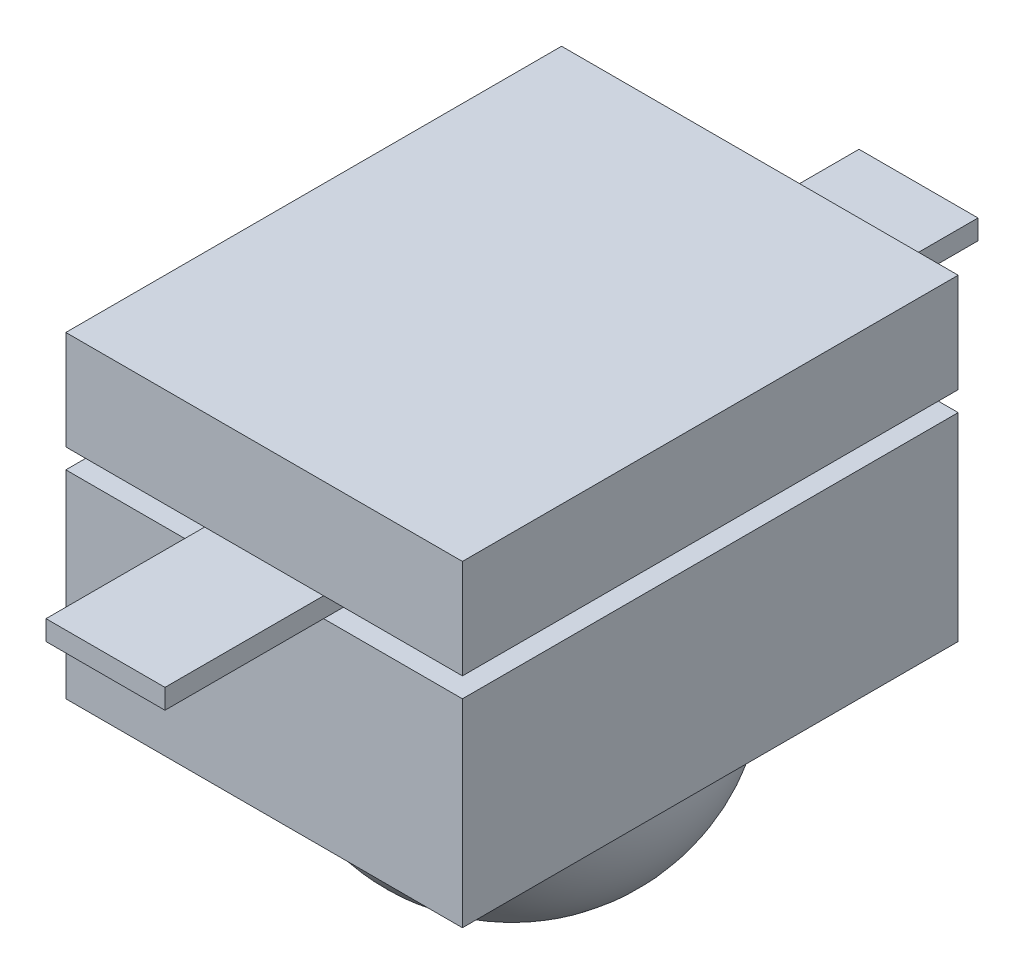
ISO-10303-21;
HEADER;
FILE_DESCRIPTION(('STEP AP214'),'2;1');
FILE_NAME('part.step','',(''),(''),'','','');
FILE_SCHEMA(('AUTOMOTIVE_DESIGN { 1 0 10303 214 1 1 1 1 }'));
ENDSEC;
DATA;
#1=APPLICATION_CONTEXT('core data for automotive mechanical design processes');
#2=APPLICATION_PROTOCOL_DEFINITION('international standard','automotive_design',2000,#1);
#3=PRODUCT_CONTEXT('',#1,'mechanical');
#4=PRODUCT('Part','Part','',(#3));
#5=PRODUCT_RELATED_PRODUCT_CATEGORY('part','',(#4));
#6=PRODUCT_DEFINITION_FORMATION('','',#4);
#7=PRODUCT_DEFINITION_CONTEXT('part definition',#1,'design');
#8=PRODUCT_DEFINITION('design','',#6,#7);
#9=PRODUCT_DEFINITION_SHAPE('','',#8);
#10=(LENGTH_UNIT() NAMED_UNIT(*) SI_UNIT(.MILLI.,.METRE.));
#11=(NAMED_UNIT(*) PLANE_ANGLE_UNIT() SI_UNIT($,.RADIAN.));
#12=(NAMED_UNIT(*) SI_UNIT($,.STERADIAN.) SOLID_ANGLE_UNIT());
#13=UNCERTAINTY_MEASURE_WITH_UNIT(LENGTH_MEASURE(1.E-05),#10,'distance_accuracy_value','');
#14=(GEOMETRIC_REPRESENTATION_CONTEXT(3) GLOBAL_UNCERTAINTY_ASSIGNED_CONTEXT((#13)) GLOBAL_UNIT_ASSIGNED_CONTEXT((#10,
#11,#12)) REPRESENTATION_CONTEXT('',''));
#15=CARTESIAN_POINT('',(0.,0.,0.));
#16=DIRECTION('',(0.,0.,1.));
#17=DIRECTION('',(1.,0.,0.));
#18=AXIS2_PLACEMENT_3D('',#15,#16,#17);
#19=CARTESIAN_POINT('',(0.,1.1,0.));
#20=DIRECTION('',(0.,-1.,0.));
#21=DIRECTION('',(0.,0.,-1.));
#22=AXIS2_PLACEMENT_3D('',#19,#20,#21);
#23=PLANE('',#22);
#24=DIRECTION('',(1.,0.,0.));
#25=VECTOR('',#24,1.);
#26=CARTESIAN_POINT('',(-8.56044129833983,1.1,9.74809966000599));
#27=LINE('',#26,#25);
#28=CARTESIAN_POINT('',(-9.86044129833983,1.1,9.74809966000599));
#29=VERTEX_POINT('',#28);
#30=CARTESIAN_POINT('',(-9.26044129833983,1.1,9.74809966000599));
#31=VERTEX_POINT('',#30);
#32=EDGE_CURVE('E124',#29,#31,#27,.T.);
#33=ORIENTED_EDGE('',*,*,#32,.F.);
#34=DIRECTION('',(0.,0.,1.));
#35=VECTOR('',#34,1.);
#36=CARTESIAN_POINT('',(-9.86044129833983,1.1,9.54809966000599));
#37=LINE('',#36,#35);
#38=CARTESIAN_POINT('',(-9.86044129833983,1.1,10.548099660006));
#39=VERTEX_POINT('',#38);
#40=EDGE_CURVE('E389',#29,#39,#37,.T.);
#41=ORIENTED_EDGE('',*,*,#40,.T.);
#42=DIRECTION('',(1.,0.,0.));
#43=VECTOR('',#42,1.);
#44=CARTESIAN_POINT('',(-9.86044129833983,1.1,10.548099660006));
#45=LINE('',#44,#43);
#46=CARTESIAN_POINT('',(-9.26044129833983,1.1,10.548099660006));
#47=VERTEX_POINT('',#46);
#48=EDGE_CURVE('E559',#39,#47,#45,.T.);
#49=ORIENTED_EDGE('',*,*,#48,.T.);
#50=DIRECTION('',(0.,0.,1.));
#51=VECTOR('',#50,1.);
#52=CARTESIAN_POINT('',(-9.26044129833983,1.1,9.54809966000599));
#53=LINE('',#52,#51);
#54=EDGE_CURVE('E108',#31,#47,#53,.T.);
#55=ORIENTED_EDGE('',*,*,#54,.F.);
#56=EDGE_LOOP('',(#33,#41,#49,#55));
#57=FACE_BOUND('',#56,.T.);
#58=ADVANCED_FACE('F104',(#57),#23,.F.);
#59=CARTESIAN_POINT('',(0.,1.,0.));
#60=DIRECTION('',(0.,1.,0.));
#61=DIRECTION('',(0.,0.,1.));
#62=AXIS2_PLACEMENT_3D('',#59,#60,#61);
#63=PLANE('',#62);
#64=DIRECTION('',(0.,0.,-1.));
#65=VECTOR('',#64,1.);
#66=CARTESIAN_POINT('',(-9.86044129833983,1.,7.44809966000599));
#67=LINE('',#66,#65);
#68=CARTESIAN_POINT('',(-9.86044129833983,1.,7.44809966000599));
#69=VERTEX_POINT('',#68);
#70=CARTESIAN_POINT('',(-9.86044129833983,1.,7.24809966000599));
#71=VERTEX_POINT('',#70);
#72=EDGE_CURVE('E366',#69,#71,#67,.T.);
#73=ORIENTED_EDGE('',*,*,#72,.T.);
#74=DIRECTION('',(-1.,0.,0.));
#75=VECTOR('',#74,1.);
#76=CARTESIAN_POINT('',(-10.5604412983398,1.,7.24809966000599));
#77=LINE('',#76,#75);
#78=CARTESIAN_POINT('',(-10.5604412983398,1.,7.24809966000599));
#79=VERTEX_POINT('',#78);
#80=EDGE_CURVE('E487',#71,#79,#77,.T.);
#81=ORIENTED_EDGE('',*,*,#80,.T.);
#82=DIRECTION('',(0.,0.,1.));
#83=VECTOR('',#82,1.);
#84=CARTESIAN_POINT('',(-10.5604412983398,1.,7.24809966000599));
#85=LINE('',#84,#83);
#86=CARTESIAN_POINT('',(-10.5604412983398,1.,9.74809966000599));
#87=VERTEX_POINT('',#86);
#88=EDGE_CURVE('E530',#79,#87,#85,.T.);
#89=ORIENTED_EDGE('',*,*,#88,.T.);
#90=DIRECTION('',(1.,0.,0.));
#91=VECTOR('',#90,1.);
#92=CARTESIAN_POINT('',(-10.5604412983398,1.,9.74809966000599));
#93=LINE('',#92,#91);
#94=CARTESIAN_POINT('',(-9.86044129833983,1.,9.74809966000599));
#95=VERTEX_POINT('',#94);
#96=EDGE_CURVE('E524',#87,#95,#93,.T.);
#97=ORIENTED_EDGE('',*,*,#96,.T.);
#98=DIRECTION('',(0.,0.,1.));
#99=VECTOR('',#98,1.);
#100=CARTESIAN_POINT('',(-9.86044129833983,1.,9.54809966000599));
#101=LINE('',#100,#99);
#102=CARTESIAN_POINT('',(-9.86044129833983,1.,9.54809966000599));
#103=VERTEX_POINT('',#102);
#104=EDGE_CURVE('E536',#103,#95,#101,.T.);
#105=ORIENTED_EDGE('',*,*,#104,.F.);
#106=DIRECTION('',(-1.,0.,0.));
#107=VECTOR('',#106,1.);
#108=CARTESIAN_POINT('',(-8.76044129833983,1.,9.54809966000599));
#109=LINE('',#108,#107);
#110=CARTESIAN_POINT('',(-10.3604412983398,1.,9.54809966000599));
#111=VERTEX_POINT('',#110);
#112=EDGE_CURVE('E950',#103,#111,#109,.T.);
#113=ORIENTED_EDGE('',*,*,#112,.T.);
#114=DIRECTION('',(0.,0.,-1.));
#115=VECTOR('',#114,1.);
#116=CARTESIAN_POINT('',(-10.3604412983398,1.,9.54809966000599));
#117=LINE('',#116,#115);
#118=CARTESIAN_POINT('',(-10.3604412983398,1.,8.94809966000599));
#119=VERTEX_POINT('',#118);
#120=EDGE_CURVE('E579',#111,#119,#117,.T.);
#121=ORIENTED_EDGE('',*,*,#120,.T.);
#122=DIRECTION('',(1.,0.,0.));
#123=VECTOR('',#122,1.);
#124=CARTESIAN_POINT('',(-10.3604412983398,1.,8.94809966000599));
#125=LINE('',#124,#123);
#126=CARTESIAN_POINT('',(-9.11044129833983,1.,8.94809966000599));
#127=VERTEX_POINT('',#126);
#128=EDGE_CURVE('E586',#119,#127,#125,.T.);
#129=ORIENTED_EDGE('',*,*,#128,.T.);
#130=DIRECTION('',(0.,0.,-1.));
#131=VECTOR('',#130,1.);
#132=CARTESIAN_POINT('',(-9.11044129833983,1.,8.94809966000599));
#133=LINE('',#132,#131);
#134=CARTESIAN_POINT('',(-9.11044129833983,1.,8.21997020015758));
#135=VERTEX_POINT('',#134);
#136=EDGE_CURVE('E996',#127,#135,#133,.T.);
#137=ORIENTED_EDGE('',*,*,#136,.T.);
#138=DIRECTION('',(1.,0.,0.));
#139=VECTOR('',#138,1.);
#140=CARTESIAN_POINT('',(-9.11044129833983,1.,8.21997020015758));
#141=LINE('',#140,#139);
#142=CARTESIAN_POINT('',(-8.76044129833983,1.,8.21997020015758));
#143=VERTEX_POINT('',#142);
#144=EDGE_CURVE('E959',#135,#143,#141,.T.);
#145=ORIENTED_EDGE('',*,*,#144,.T.);
#146=DIRECTION('',(0.,0.,1.));
#147=VECTOR('',#146,1.);
#148=CARTESIAN_POINT('',(-8.76044129833983,1.,8.21997020015758));
#149=LINE('',#148,#147);
#150=CARTESIAN_POINT('',(-8.76044129833983,1.,9.54809966000599));
#151=VERTEX_POINT('',#150);
#152=EDGE_CURVE('E955',#143,#151,#149,.T.);
#153=ORIENTED_EDGE('',*,*,#152,.T.);
#154=CARTESIAN_POINT('',(-9.26044129833983,1.,9.54809966000599));
#155=VERTEX_POINT('',#154);
#156=EDGE_CURVE('E954',#151,#155,#109,.T.);
#157=ORIENTED_EDGE('',*,*,#156,.T.);
#158=DIRECTION('',(0.,0.,1.));
#159=VECTOR('',#158,1.);
#160=CARTESIAN_POINT('',(-9.26044129833983,1.,9.54809966000599));
#161=LINE('',#160,#159);
#162=CARTESIAN_POINT('',(-9.26044129833983,1.,9.74809966000599));
#163=VERTEX_POINT('',#162);
#164=EDGE_CURVE('E551',#155,#163,#161,.T.);
#165=ORIENTED_EDGE('',*,*,#164,.T.);
#166=CARTESIAN_POINT('',(-8.56044129833983,1.,9.74809966000599));
#167=VERTEX_POINT('',#166);
#168=EDGE_CURVE('E528',#163,#167,#93,.T.);
#169=ORIENTED_EDGE('',*,*,#168,.T.);
#170=DIRECTION('',(0.,0.,-1.));
#171=VECTOR('',#170,1.);
#172=CARTESIAN_POINT('',(-8.56044129833983,1.,7.24809966000599));
#173=LINE('',#172,#171);
#174=CARTESIAN_POINT('',(-8.56044129833983,1.,7.24809966000599));
#175=VERTEX_POINT('',#174);
#176=EDGE_CURVE('E515',#167,#175,#173,.T.);
#177=ORIENTED_EDGE('',*,*,#176,.T.);
#178=CARTESIAN_POINT('',(-9.26044129833983,1.,7.24809966000599));
#179=VERTEX_POINT('',#178);
#180=EDGE_CURVE('E500',#175,#179,#77,.T.);
#181=ORIENTED_EDGE('',*,*,#180,.T.);
#182=DIRECTION('',(0.,0.,-1.));
#183=VECTOR('',#182,1.);
#184=CARTESIAN_POINT('',(-9.26044129833983,1.,7.44809966000599));
#185=LINE('',#184,#183);
#186=CARTESIAN_POINT('',(-9.26044129833983,1.,7.44809966000599));
#187=VERTEX_POINT('',#186);
#188=EDGE_CURVE('E354',#187,#179,#185,.T.);
#189=ORIENTED_EDGE('',*,*,#188,.F.);
#190=DIRECTION('',(-1.,0.,0.));
#191=VECTOR('',#190,1.);
#192=CARTESIAN_POINT('',(-8.76044129833983,1.,7.44809966000599));
#193=LINE('',#192,#191);
#194=CARTESIAN_POINT('',(-8.76044129833983,1.,7.44809966000599));
#195=VERTEX_POINT('',#194);
#196=EDGE_CURVE('E439',#195,#187,#193,.T.);
#197=ORIENTED_EDGE('',*,*,#196,.F.);
#198=DIRECTION('',(0.,0.,-1.));
#199=VECTOR('',#198,1.);
#200=CARTESIAN_POINT('',(-8.76044129833983,1.,8.11997020015759));
#201=LINE('',#200,#199);
#202=CARTESIAN_POINT('',(-8.76044129833983,1.,8.11997020015759));
#203=VERTEX_POINT('',#202);
#204=EDGE_CURVE('E428',#203,#195,#201,.T.);
#205=ORIENTED_EDGE('',*,*,#204,.F.);
#206=DIRECTION('',(1.,0.,0.));
#207=VECTOR('',#206,1.);
#208=CARTESIAN_POINT('',(-9.21044129833983,1.,8.11997020015759));
#209=LINE('',#208,#207);
#210=CARTESIAN_POINT('',(-9.21044129833983,1.,8.11997020015759));
#211=VERTEX_POINT('',#210);
#212=EDGE_CURVE('E459',#211,#203,#209,.T.);
#213=ORIENTED_EDGE('',*,*,#212,.F.);
#214=DIRECTION('',(0.,0.,-1.));
#215=VECTOR('',#214,1.);
#216=CARTESIAN_POINT('',(-9.21044129833983,1.,8.84809966000599));
#217=LINE('',#216,#215);
#218=CARTESIAN_POINT('',(-9.21044129833983,1.,8.84809966000599));
#219=VERTEX_POINT('',#218);
#220=EDGE_CURVE('E462',#219,#211,#217,.T.);
#221=ORIENTED_EDGE('',*,*,#220,.F.);
#222=DIRECTION('',(1.,0.,0.));
#223=VECTOR('',#222,1.);
#224=CARTESIAN_POINT('',(-10.3604412983398,1.,8.84809966000599));
#225=LINE('',#224,#223);
#226=CARTESIAN_POINT('',(-10.3604412983398,1.,8.84809966000599));
#227=VERTEX_POINT('',#226);
#228=EDGE_CURVE('E464',#227,#219,#225,.T.);
#229=ORIENTED_EDGE('',*,*,#228,.F.);
#230=DIRECTION('',(0.,0.,1.));
#231=VECTOR('',#230,1.);
#232=CARTESIAN_POINT('',(-10.3604412983398,1.,7.44809966000599));
#233=LINE('',#232,#231);
#234=CARTESIAN_POINT('',(-10.3604412983398,1.,7.44809966000599));
#235=VERTEX_POINT('',#234);
#236=EDGE_CURVE('E435',#235,#227,#233,.T.);
#237=ORIENTED_EDGE('',*,*,#236,.F.);
#238=EDGE_CURVE('E432',#69,#235,#193,.T.);
#239=ORIENTED_EDGE('',*,*,#238,.F.);
#240=EDGE_LOOP('',(#73,#81,#89,#97,#105,#113,#121,#129,#137,#145,#153,#157,#165,#169,#177,#181,
#189,#197,#205,#213,#221,#229,#237,#239));
#241=FACE_BOUND('',#240,.T.);
#242=ADVANCED_FACE('F484',(#241),#63,.T.);
#243=CARTESIAN_POINT('',(0.,0.,0.));
#244=DIRECTION('',(0.,1.,0.));
#245=DIRECTION('',(0.,0.,1.));
#246=AXIS2_PLACEMENT_3D('',#243,#244,#245);
#247=PLANE('',#246);
#248=DIRECTION('',(0.,0.,1.));
#249=VECTOR('',#248,1.);
#250=CARTESIAN_POINT('',(-10.5604412983398,0.,7.24809966000599));
#251=LINE('',#250,#249);
#252=CARTESIAN_POINT('',(-10.5604412983398,0.,7.24809966000599));
#253=VERTEX_POINT('',#252);
#254=CARTESIAN_POINT('',(-10.5604412983398,0.,9.74809966000599));
#255=VERTEX_POINT('',#254);
#256=EDGE_CURVE('E574',#253,#255,#251,.T.);
#257=ORIENTED_EDGE('',*,*,#256,.F.);
#258=DIRECTION('',(-1.,0.,0.));
#259=VECTOR('',#258,1.);
#260=CARTESIAN_POINT('',(-10.5604412983398,0.,7.24809966000599));
#261=LINE('',#260,#259);
#262=CARTESIAN_POINT('',(-8.56044129833983,0.,7.24809966000599));
#263=VERTEX_POINT('',#262);
#264=EDGE_CURVE('E532',#263,#253,#261,.T.);
#265=ORIENTED_EDGE('',*,*,#264,.F.);
#266=DIRECTION('',(0.,0.,-1.));
#267=VECTOR('',#266,1.);
#268=CARTESIAN_POINT('',(-8.56044129833983,0.,7.24809966000599));
#269=LINE('',#268,#267);
#270=CARTESIAN_POINT('',(-8.56044129833983,0.,9.74809966000599));
#271=VERTEX_POINT('',#270);
#272=EDGE_CURVE('E613',#271,#263,#269,.T.);
#273=ORIENTED_EDGE('',*,*,#272,.F.);
#274=DIRECTION('',(1.,0.,0.));
#275=VECTOR('',#274,1.);
#276=CARTESIAN_POINT('',(-10.5604412983398,0.,9.74809966000599));
#277=LINE('',#276,#275);
#278=EDGE_CURVE('E607',#255,#271,#277,.T.);
#279=ORIENTED_EDGE('',*,*,#278,.F.);
#280=EDGE_LOOP('',(#257,#265,#273,#279));
#281=FACE_BOUND('',#280,.T.);
#282=CARTESIAN_POINT('',(-9.56044129833983,0.,8.49809966000599));
#283=DIRECTION('',(0.,1.,0.));
#284=DIRECTION('',(0.,0.,1.));
#285=AXIS2_PLACEMENT_3D('',#282,#283,#284);
#286=CIRCLE('',#285,0.9);
#287=CARTESIAN_POINT('',(-9.56044129833983,0.,9.39809966000599));
#288=VERTEX_POINT('',#287);
#289=EDGE_CURVE('E114',#288,#288,#286,.F.);
#290=ORIENTED_EDGE('',*,*,#289,.F.);
#291=EDGE_LOOP('',(#290));
#292=FACE_BOUND('',#291,.T.);
#293=ADVANCED_FACE('F623',(#281,#292),#247,.F.);
#294=CARTESIAN_POINT('',(-10.5604412983398,1.,7.24809966000599));
#295=DIRECTION('',(1.,0.,0.));
#296=DIRECTION('',(0.,0.,-1.));
#297=AXIS2_PLACEMENT_3D('',#294,#295,#296);
#298=PLANE('',#297);
#299=ORIENTED_EDGE('',*,*,#256,.T.);
#300=DIRECTION('',(0.,-1.,0.));
#301=VECTOR('',#300,1.);
#302=CARTESIAN_POINT('',(-10.5604412983398,1.,9.74809966000599));
#303=LINE('',#302,#301);
#304=EDGE_CURVE('E610',#87,#255,#303,.T.);
#305=ORIENTED_EDGE('',*,*,#304,.F.);
#306=ORIENTED_EDGE('',*,*,#88,.F.);
#307=DIRECTION('',(0.,-1.,0.));
#308=VECTOR('',#307,1.);
#309=CARTESIAN_POINT('',(-10.5604412983398,1.,7.24809966000599));
#310=LINE('',#309,#308);
#311=EDGE_CURVE('E518',#79,#253,#310,.T.);
#312=ORIENTED_EDGE('',*,*,#311,.T.);
#313=EDGE_LOOP('',(#299,#305,#306,#312));
#314=FACE_BOUND('',#313,.T.);
#315=ADVANCED_FACE('F625',(#314),#298,.F.);
#316=CARTESIAN_POINT('',(-10.5604412983398,1.,9.74809966000599));
#317=DIRECTION('',(0.,0.,-1.));
#318=DIRECTION('',(-1.,0.,0.));
#319=AXIS2_PLACEMENT_3D('',#316,#317,#318);
#320=PLANE('',#319);
#321=ORIENTED_EDGE('',*,*,#278,.T.);
#322=DIRECTION('',(0.,-1.,0.));
#323=VECTOR('',#322,1.);
#324=CARTESIAN_POINT('',(-8.56044129833983,1.,9.74809966000599));
#325=LINE('',#324,#323);
#326=EDGE_CURVE('E604',#167,#271,#325,.T.);
#327=ORIENTED_EDGE('',*,*,#326,.F.);
#328=ORIENTED_EDGE('',*,*,#168,.F.);
#329=EDGE_CURVE('E526',#95,#163,#93,.T.);
#330=ORIENTED_EDGE('',*,*,#329,.F.);
#331=ORIENTED_EDGE('',*,*,#96,.F.);
#332=ORIENTED_EDGE('',*,*,#304,.T.);
#333=EDGE_LOOP('',(#321,#327,#328,#330,#331,#332));
#334=FACE_BOUND('',#333,.T.);
#335=ADVANCED_FACE('F605',(#334),#320,.F.);
#336=CARTESIAN_POINT('',(-8.56044129833983,1.,7.24809966000599));
#337=DIRECTION('',(-1.,0.,0.));
#338=DIRECTION('',(0.,0.,1.));
#339=AXIS2_PLACEMENT_3D('',#336,#337,#338);
#340=PLANE('',#339);
#341=ORIENTED_EDGE('',*,*,#272,.T.);
#342=DIRECTION('',(0.,-1.,0.));
#343=VECTOR('',#342,1.);
#344=CARTESIAN_POINT('',(-8.56044129833983,1.,7.24809966000599));
#345=LINE('',#344,#343);
#346=EDGE_CURVE('E520',#175,#263,#345,.T.);
#347=ORIENTED_EDGE('',*,*,#346,.F.);
#348=ORIENTED_EDGE('',*,*,#176,.F.);
#349=ORIENTED_EDGE('',*,*,#326,.T.);
#350=EDGE_LOOP('',(#341,#347,#348,#349));
#351=FACE_BOUND('',#350,.T.);
#352=ADVANCED_FACE('F612',(#351),#340,.F.);
#353=CARTESIAN_POINT('',(-10.5604412983398,1.,7.24809966000599));
#354=DIRECTION('',(0.,0.,1.));
#355=DIRECTION('',(1.,0.,0.));
#356=AXIS2_PLACEMENT_3D('',#353,#354,#355);
#357=PLANE('',#356);
#358=ORIENTED_EDGE('',*,*,#264,.T.);
#359=ORIENTED_EDGE('',*,*,#311,.F.);
#360=ORIENTED_EDGE('',*,*,#80,.F.);
#361=EDGE_CURVE('E493',#179,#71,#77,.T.);
#362=ORIENTED_EDGE('',*,*,#361,.F.);
#363=ORIENTED_EDGE('',*,*,#180,.F.);
#364=ORIENTED_EDGE('',*,*,#346,.T.);
#365=EDGE_LOOP('',(#358,#359,#360,#362,#363,#364));
#366=FACE_BOUND('',#365,.T.);
#367=ADVANCED_FACE('F900',(#366),#357,.F.);
#368=CARTESIAN_POINT('',(-9.56044129833983,0.,8.49809966000599));
#369=DIRECTION('',(0.,0.,1.));
#370=DIRECTION('',(1.,0.,0.));
#371=AXIS2_PLACEMENT_3D('',#368,#369,#370);
#372=SPHERICAL_SURFACE('',#371,0.9);
#373=CARTESIAN_POINT('',(-9.56044129833983,0.,8.49809966000599));
#374=DIRECTION('',(0.,1.,0.));
#375=DIRECTION('',(0.,0.,1.));
#376=AXIS2_PLACEMENT_3D('',#373,#374,#375);
#377=SPHERICAL_SURFACE('',#376,0.9);
#378=ORIENTED_EDGE('',*,*,#289,.T.);
#379=EDGE_LOOP('',(#378));
#380=FACE_BOUND('',#379,.T.);
#381=ADVANCED_FACE('F106',(#380),#377,.T.);
#382=CARTESIAN_POINT('',(-10.3604412983398,1.1,8.94809966000599));
#383=DIRECTION('',(0.,0.,-1.));
#384=DIRECTION('',(-1.,0.,0.));
#385=AXIS2_PLACEMENT_3D('',#382,#383,#384);
#386=PLANE('',#385);
#387=ORIENTED_EDGE('',*,*,#128,.F.);
#388=DIRECTION('',(0.,-1.,0.));
#389=VECTOR('',#388,1.);
#390=CARTESIAN_POINT('',(-10.3604412983398,1.1,8.94809966000599));
#391=LINE('',#390,#389);
#392=CARTESIAN_POINT('',(-10.3604412983398,1.1,8.94809966000599));
#393=VERTEX_POINT('',#392);
#394=EDGE_CURVE('E976',#393,#119,#391,.T.);
#395=ORIENTED_EDGE('',*,*,#394,.F.);
#396=DIRECTION('',(1.,0.,0.));
#397=VECTOR('',#396,1.);
#398=CARTESIAN_POINT('',(-10.3604412983398,1.1,8.94809966000599));
#399=LINE('',#398,#397);
#400=CARTESIAN_POINT('',(-9.11044129833983,1.1,8.94809966000599));
#401=VERTEX_POINT('',#400);
#402=EDGE_CURVE('E1026',#393,#401,#399,.T.);
#403=ORIENTED_EDGE('',*,*,#402,.T.);
#404=DIRECTION('',(0.,-1.,0.));
#405=VECTOR('',#404,1.);
#406=CARTESIAN_POINT('',(-9.11044129833983,1.1,8.94809966000599));
#407=LINE('',#406,#405);
#408=EDGE_CURVE('E975',#401,#127,#407,.T.);
#409=ORIENTED_EDGE('',*,*,#408,.T.);
#410=EDGE_LOOP('',(#387,#395,#403,#409));
#411=FACE_BOUND('',#410,.T.);
#412=ADVANCED_FACE('F664',(#411),#386,.T.);
#413=CARTESIAN_POINT('',(-9.11044129833983,1.1,8.94809966000599));
#414=DIRECTION('',(-1.,0.,0.));
#415=DIRECTION('',(0.,0.,1.));
#416=AXIS2_PLACEMENT_3D('',#413,#414,#415);
#417=PLANE('',#416);
#418=ORIENTED_EDGE('',*,*,#136,.F.);
#419=ORIENTED_EDGE('',*,*,#408,.F.);
#420=DIRECTION('',(0.,0.,-1.));
#421=VECTOR('',#420,1.);
#422=CARTESIAN_POINT('',(-9.11044129833983,1.1,8.94809966000599));
#423=LINE('',#422,#421);
#424=CARTESIAN_POINT('',(-9.11044129833983,1.1,8.21997020015758));
#425=VERTEX_POINT('',#424);
#426=EDGE_CURVE('E988',#401,#425,#423,.T.);
#427=ORIENTED_EDGE('',*,*,#426,.T.);
#428=DIRECTION('',(0.,-1.,0.));
#429=VECTOR('',#428,1.);
#430=CARTESIAN_POINT('',(-9.11044129833983,1.1,8.21997020015758));
#431=LINE('',#430,#429);
#432=EDGE_CURVE('E973',#425,#135,#431,.T.);
#433=ORIENTED_EDGE('',*,*,#432,.T.);
#434=EDGE_LOOP('',(#418,#419,#427,#433));
#435=FACE_BOUND('',#434,.T.);
#436=ADVANCED_FACE('F660',(#435),#417,.T.);
#437=CARTESIAN_POINT('',(-9.11044129833983,1.1,8.21997020015758));
#438=DIRECTION('',(0.,0.,-1.));
#439=DIRECTION('',(-1.,0.,0.));
#440=AXIS2_PLACEMENT_3D('',#437,#438,#439);
#441=PLANE('',#440);
#442=ORIENTED_EDGE('',*,*,#144,.F.);
#443=ORIENTED_EDGE('',*,*,#432,.F.);
#444=DIRECTION('',(1.,0.,0.));
#445=VECTOR('',#444,1.);
#446=CARTESIAN_POINT('',(-9.11044129833983,1.1,8.21997020015758));
#447=LINE('',#446,#445);
#448=CARTESIAN_POINT('',(-8.76044129833983,1.1,8.21997020015758));
#449=VERTEX_POINT('',#448);
#450=EDGE_CURVE('E984',#425,#449,#447,.T.);
#451=ORIENTED_EDGE('',*,*,#450,.T.);
#452=DIRECTION('',(0.,-1.,0.));
#453=VECTOR('',#452,1.);
#454=CARTESIAN_POINT('',(-8.76044129833983,1.1,8.21997020015758));
#455=LINE('',#454,#453);
#456=EDGE_CURVE('E971',#449,#143,#455,.T.);
#457=ORIENTED_EDGE('',*,*,#456,.T.);
#458=EDGE_LOOP('',(#442,#443,#451,#457));
#459=FACE_BOUND('',#458,.T.);
#460=ADVANCED_FACE('F657',(#459),#441,.T.);
#461=CARTESIAN_POINT('',(-10.3604412983398,1.1,9.54809966000599));
#462=DIRECTION('',(-1.,0.,0.));
#463=DIRECTION('',(0.,0.,1.));
#464=AXIS2_PLACEMENT_3D('',#461,#462,#463);
#465=PLANE('',#464);
#466=ORIENTED_EDGE('',*,*,#120,.F.);
#467=DIRECTION('',(0.,-1.,0.));
#468=VECTOR('',#467,1.);
#469=CARTESIAN_POINT('',(-10.3604412983398,1.1,9.54809966000599));
#470=LINE('',#469,#468);
#471=CARTESIAN_POINT('',(-10.3604412983398,1.1,9.54809966000599));
#472=VERTEX_POINT('',#471);
#473=EDGE_CURVE('E568',#472,#111,#470,.T.);
#474=ORIENTED_EDGE('',*,*,#473,.F.);
#475=DIRECTION('',(0.,0.,-1.));
#476=VECTOR('',#475,1.);
#477=CARTESIAN_POINT('',(-10.3604412983398,1.1,9.54809966000599));
#478=LINE('',#477,#476);
#479=EDGE_CURVE('E368',#472,#393,#478,.T.);
#480=ORIENTED_EDGE('',*,*,#479,.T.);
#481=ORIENTED_EDGE('',*,*,#394,.T.);
#482=EDGE_LOOP('',(#466,#474,#480,#481));
#483=FACE_BOUND('',#482,.T.);
#484=ADVANCED_FACE('F655',(#483),#465,.T.);
#485=CARTESIAN_POINT('',(-8.76044129833983,1.1,8.21997020015758));
#486=DIRECTION('',(1.,0.,0.));
#487=DIRECTION('',(0.,0.,-1.));
#488=AXIS2_PLACEMENT_3D('',#485,#486,#487);
#489=PLANE('',#488);
#490=ORIENTED_EDGE('',*,*,#152,.F.);
#491=ORIENTED_EDGE('',*,*,#456,.F.);
#492=DIRECTION('',(0.,0.,1.));
#493=VECTOR('',#492,1.);
#494=CARTESIAN_POINT('',(-8.76044129833983,1.1,8.21997020015758));
#495=LINE('',#494,#493);
#496=CARTESIAN_POINT('',(-8.76044129833983,1.1,9.54809966000599));
#497=VERTEX_POINT('',#496);
#498=EDGE_CURVE('E982',#449,#497,#495,.T.);
#499=ORIENTED_EDGE('',*,*,#498,.T.);
#500=DIRECTION('',(0.,-1.,0.));
#501=VECTOR('',#500,1.);
#502=CARTESIAN_POINT('',(-8.76044129833983,1.1,9.54809966000599));
#503=LINE('',#502,#501);
#504=EDGE_CURVE('E969',#497,#151,#503,.T.);
#505=ORIENTED_EDGE('',*,*,#504,.T.);
#506=EDGE_LOOP('',(#490,#491,#499,#505));
#507=FACE_BOUND('',#506,.T.);
#508=ADVANCED_FACE('F647',(#507),#489,.T.);
#509=CARTESIAN_POINT('',(0.,1.,0.));
#510=DIRECTION('',(0.,-1.,0.));
#511=DIRECTION('',(0.,0.,-1.));
#512=AXIS2_PLACEMENT_3D('',#509,#510,#511);
#513=PLANE('',#512);
#514=CARTESIAN_POINT('',(-9.86044129833983,1.,10.548099660006));
#515=VERTEX_POINT('',#514);
#516=EDGE_CURVE('E533',#95,#515,#101,.T.);
#517=ORIENTED_EDGE('',*,*,#516,.F.);
#518=ORIENTED_EDGE('',*,*,#329,.T.);
#519=CARTESIAN_POINT('',(-9.26044129833983,1.,10.548099660006));
#520=VERTEX_POINT('',#519);
#521=EDGE_CURVE('E431',#163,#520,#161,.T.);
#522=ORIENTED_EDGE('',*,*,#521,.T.);
#523=DIRECTION('',(1.,0.,0.));
#524=VECTOR('',#523,1.);
#525=CARTESIAN_POINT('',(-9.86044129833983,1.,10.548099660006));
#526=LINE('',#525,#524);
#527=EDGE_CURVE('E537',#515,#520,#526,.T.);
#528=ORIENTED_EDGE('',*,*,#527,.F.);
#529=EDGE_LOOP('',(#517,#518,#522,#528));
#530=FACE_BOUND('',#529,.T.);
#531=ADVANCED_FACE('F597',(#530),#513,.T.);
#532=CARTESIAN_POINT('',(-8.76044129833983,1.1,9.54809966000599));
#533=DIRECTION('',(0.,0.,1.));
#534=DIRECTION('',(1.,0.,0.));
#535=AXIS2_PLACEMENT_3D('',#532,#533,#534);
#536=PLANE('',#535);
#537=DIRECTION('',(-1.,0.,0.));
#538=VECTOR('',#537,1.);
#539=CARTESIAN_POINT('',(-8.76044129833983,1.1,9.54809966000599));
#540=LINE('',#539,#538);
#541=CARTESIAN_POINT('',(-9.26044129833983,1.1,9.54809966000599));
#542=VERTEX_POINT('',#541);
#543=EDGE_CURVE('E963',#497,#542,#540,.T.);
#544=ORIENTED_EDGE('',*,*,#543,.T.);
#545=DIRECTION('',(0.,-1.,0.));
#546=VECTOR('',#545,1.);
#547=CARTESIAN_POINT('',(-9.26044129833983,1.1,9.54809966000599));
#548=LINE('',#547,#546);
#549=EDGE_CURVE('E564',#542,#155,#548,.T.);
#550=ORIENTED_EDGE('',*,*,#549,.T.);
#551=ORIENTED_EDGE('',*,*,#156,.F.);
#552=ORIENTED_EDGE('',*,*,#504,.F.);
#553=EDGE_LOOP('',(#544,#550,#551,#552));
#554=FACE_BOUND('',#553,.T.);
#555=ADVANCED_FACE('F646',(#554),#536,.T.);
#556=DIRECTION('',(0.,-1.,0.));
#557=VECTOR('',#556,1.);
#558=CARTESIAN_POINT('',(-9.86044129833983,1.1,9.54809966000599));
#559=LINE('',#558,#557);
#560=CARTESIAN_POINT('',(-9.86044129833983,1.1,9.54809966000599));
#561=VERTEX_POINT('',#560);
#562=EDGE_CURVE('E567',#561,#103,#559,.T.);
#563=ORIENTED_EDGE('',*,*,#562,.F.);
#564=EDGE_CURVE('E569',#561,#472,#540,.T.);
#565=ORIENTED_EDGE('',*,*,#564,.T.);
#566=ORIENTED_EDGE('',*,*,#473,.T.);
#567=ORIENTED_EDGE('',*,*,#112,.F.);
#568=EDGE_LOOP('',(#563,#565,#566,#567));
#569=FACE_BOUND('',#568,.T.);
#570=ADVANCED_FACE('F648',(#569),#536,.T.);
#571=CARTESIAN_POINT('',(-9.86044129833983,1.1,10.548099660006));
#572=DIRECTION('',(0.,0.,-1.));
#573=DIRECTION('',(-1.,0.,0.));
#574=AXIS2_PLACEMENT_3D('',#571,#572,#573);
#575=PLANE('',#574);
#576=ORIENTED_EDGE('',*,*,#527,.T.);
#577=DIRECTION('',(0.,-1.,0.));
#578=VECTOR('',#577,1.);
#579=CARTESIAN_POINT('',(-9.26044129833983,1.1,10.548099660006));
#580=LINE('',#579,#578);
#581=EDGE_CURVE('E548',#47,#520,#580,.T.);
#582=ORIENTED_EDGE('',*,*,#581,.F.);
#583=ORIENTED_EDGE('',*,*,#48,.F.);
#584=DIRECTION('',(0.,-1.,0.));
#585=VECTOR('',#584,1.);
#586=CARTESIAN_POINT('',(-9.86044129833983,1.1,10.548099660006));
#587=LINE('',#586,#585);
#588=EDGE_CURVE('E577',#39,#515,#587,.T.);
#589=ORIENTED_EDGE('',*,*,#588,.T.);
#590=EDGE_LOOP('',(#576,#582,#583,#589));
#591=FACE_BOUND('',#590,.T.);
#592=ADVANCED_FACE('F595',(#591),#575,.F.);
#593=CARTESIAN_POINT('',(-9.26044129833983,1.1,9.54809966000599));
#594=DIRECTION('',(1.,0.,0.));
#595=DIRECTION('',(0.,0.,-1.));
#596=AXIS2_PLACEMENT_3D('',#593,#594,#595);
#597=PLANE('',#596);
#598=ORIENTED_EDGE('',*,*,#164,.F.);
#599=ORIENTED_EDGE('',*,*,#549,.F.);
#600=EDGE_CURVE('E556',#542,#31,#53,.T.);
#601=ORIENTED_EDGE('',*,*,#600,.T.);
#602=ORIENTED_EDGE('',*,*,#54,.T.);
#603=ORIENTED_EDGE('',*,*,#581,.T.);
#604=ORIENTED_EDGE('',*,*,#521,.F.);
#605=EDGE_LOOP('',(#598,#599,#601,#602,#603,#604));
#606=FACE_BOUND('',#605,.T.);
#607=ADVANCED_FACE('F593',(#606),#597,.T.);
#608=CARTESIAN_POINT('',(-9.86044129833983,1.1,9.54809966000599));
#609=DIRECTION('',(1.,0.,0.));
#610=DIRECTION('',(0.,0.,-1.));
#611=AXIS2_PLACEMENT_3D('',#608,#609,#610);
#612=PLANE('',#611);
#613=ORIENTED_EDGE('',*,*,#104,.T.);
#614=ORIENTED_EDGE('',*,*,#516,.T.);
#615=ORIENTED_EDGE('',*,*,#588,.F.);
#616=ORIENTED_EDGE('',*,*,#40,.F.);
#617=EDGE_CURVE('E545',#561,#29,#37,.T.);
#618=ORIENTED_EDGE('',*,*,#617,.F.);
#619=ORIENTED_EDGE('',*,*,#562,.T.);
#620=EDGE_LOOP('',(#613,#614,#615,#616,#618,#619));
#621=FACE_BOUND('',#620,.T.);
#622=ADVANCED_FACE('F652',(#621),#612,.F.);
#623=CARTESIAN_POINT('',(0.,1.,0.));
#624=DIRECTION('',(0.,1.,0.));
#625=DIRECTION('',(0.,0.,1.));
#626=AXIS2_PLACEMENT_3D('',#623,#624,#625);
#627=PLANE('',#626);
#628=CARTESIAN_POINT('',(-9.26044129833983,1.,6.44809966000599));
#629=VERTEX_POINT('',#628);
#630=EDGE_CURVE('E357',#179,#629,#185,.T.);
#631=ORIENTED_EDGE('',*,*,#630,.F.);
#632=ORIENTED_EDGE('',*,*,#361,.T.);
#633=CARTESIAN_POINT('',(-9.86044129833983,1.,6.44809966000599));
#634=VERTEX_POINT('',#633);
#635=EDGE_CURVE('E363',#71,#634,#67,.T.);
#636=ORIENTED_EDGE('',*,*,#635,.T.);
#637=DIRECTION('',(1.,0.,0.));
#638=VECTOR('',#637,1.);
#639=CARTESIAN_POINT('',(-9.86044129833983,1.,6.44809966000599));
#640=LINE('',#639,#638);
#641=EDGE_CURVE('E360',#634,#629,#640,.T.);
#642=ORIENTED_EDGE('',*,*,#641,.T.);
#643=EDGE_LOOP('',(#631,#632,#636,#642));
#644=FACE_BOUND('',#643,.T.);
#645=ADVANCED_FACE('F494',(#644),#627,.F.);
#646=CARTESIAN_POINT('',(-9.26044129833983,1.1,7.44809966000599));
#647=DIRECTION('',(-1.,0.,0.));
#648=DIRECTION('',(0.,0.,1.));
#649=AXIS2_PLACEMENT_3D('',#646,#647,#648);
#650=PLANE('',#649);
#651=ORIENTED_EDGE('',*,*,#188,.T.);
#652=ORIENTED_EDGE('',*,*,#630,.T.);
#653=DIRECTION('',(0.,-1.,0.));
#654=VECTOR('',#653,1.);
#655=CARTESIAN_POINT('',(-9.26044129833983,1.1,6.44809966000599));
#656=LINE('',#655,#654);
#657=CARTESIAN_POINT('',(-9.26044129833983,1.1,6.44809966000599));
#658=VERTEX_POINT('',#657);
#659=EDGE_CURVE('E346',#658,#629,#656,.T.);
#660=ORIENTED_EDGE('',*,*,#659,.F.);
#661=DIRECTION('',(0.,0.,-1.));
#662=VECTOR('',#661,1.);
#663=CARTESIAN_POINT('',(-9.26044129833983,1.1,7.44809966000599));
#664=LINE('',#663,#662);
#665=CARTESIAN_POINT('',(-9.26044129833983,1.1,7.24809966000599));
#666=VERTEX_POINT('',#665);
#667=EDGE_CURVE('E388',#666,#658,#664,.T.);
#668=ORIENTED_EDGE('',*,*,#667,.F.);
#669=CARTESIAN_POINT('',(-9.26044129833983,1.1,7.44809966000599));
#670=VERTEX_POINT('',#669);
#671=EDGE_CURVE('E367',#670,#666,#664,.T.);
#672=ORIENTED_EDGE('',*,*,#671,.F.);
#673=DIRECTION('',(0.,-1.,0.));
#674=VECTOR('',#673,1.);
#675=CARTESIAN_POINT('',(-9.26044129833983,1.1,7.44809966000599));
#676=LINE('',#675,#674);
#677=EDGE_CURVE('E343',#670,#187,#676,.T.);
#678=ORIENTED_EDGE('',*,*,#677,.T.);
#679=EDGE_LOOP('',(#651,#652,#660,#668,#672,#678));
#680=FACE_BOUND('',#679,.T.);
#681=ADVANCED_FACE('F511',(#680),#650,.F.);
#682=CARTESIAN_POINT('',(-9.86044129833983,1.1,6.44809966000599));
#683=DIRECTION('',(0.,0.,-1.));
#684=DIRECTION('',(-1.,0.,0.));
#685=AXIS2_PLACEMENT_3D('',#682,#683,#684);
#686=PLANE('',#685);
#687=ORIENTED_EDGE('',*,*,#641,.F.);
#688=DIRECTION('',(0.,-1.,0.));
#689=VECTOR('',#688,1.);
#690=CARTESIAN_POINT('',(-9.86044129833983,1.1,6.44809966000599));
#691=LINE('',#690,#689);
#692=CARTESIAN_POINT('',(-9.86044129833983,1.1,6.44809966000599));
#693=VERTEX_POINT('',#692);
#694=EDGE_CURVE('E401',#693,#634,#691,.T.);
#695=ORIENTED_EDGE('',*,*,#694,.F.);
#696=DIRECTION('',(1.,0.,0.));
#697=VECTOR('',#696,1.);
#698=CARTESIAN_POINT('',(-9.86044129833983,1.1,6.44809966000599));
#699=LINE('',#698,#697);
#700=EDGE_CURVE('E361',#693,#658,#699,.T.);
#701=ORIENTED_EDGE('',*,*,#700,.T.);
#702=ORIENTED_EDGE('',*,*,#659,.T.);
#703=EDGE_LOOP('',(#687,#695,#701,#702));
#704=FACE_BOUND('',#703,.T.);
#705=ADVANCED_FACE('F508',(#704),#686,.T.);
#706=CARTESIAN_POINT('',(-9.86044129833983,1.1,7.44809966000599));
#707=DIRECTION('',(-1.,0.,0.));
#708=DIRECTION('',(0.,0.,1.));
#709=AXIS2_PLACEMENT_3D('',#706,#707,#708);
#710=PLANE('',#709);
#711=ORIENTED_EDGE('',*,*,#72,.F.);
#712=DIRECTION('',(0.,-1.,0.));
#713=VECTOR('',#712,1.);
#714=CARTESIAN_POINT('',(-9.86044129833983,1.1,7.44809966000599));
#715=LINE('',#714,#713);
#716=CARTESIAN_POINT('',(-9.86044129833983,1.1,7.44809966000599));
#717=VERTEX_POINT('',#716);
#718=EDGE_CURVE('E386',#717,#69,#715,.T.);
#719=ORIENTED_EDGE('',*,*,#718,.F.);
#720=DIRECTION('',(0.,0.,-1.));
#721=VECTOR('',#720,1.);
#722=CARTESIAN_POINT('',(-9.86044129833983,1.1,7.44809966000599));
#723=LINE('',#722,#721);
#724=CARTESIAN_POINT('',(-9.86044129833983,1.1,7.24809966000599));
#725=VERTEX_POINT('',#724);
#726=EDGE_CURVE('E379',#717,#725,#723,.T.);
#727=ORIENTED_EDGE('',*,*,#726,.T.);
#728=EDGE_CURVE('E383',#725,#693,#723,.T.);
#729=ORIENTED_EDGE('',*,*,#728,.T.);
#730=ORIENTED_EDGE('',*,*,#694,.T.);
#731=ORIENTED_EDGE('',*,*,#635,.F.);
#732=EDGE_LOOP('',(#711,#719,#727,#729,#730,#731));
#733=FACE_BOUND('',#732,.T.);
#734=ADVANCED_FACE('F502',(#733),#710,.T.);
#735=CARTESIAN_POINT('',(0.,1.1,0.));
#736=DIRECTION('',(0.,1.,0.));
#737=DIRECTION('',(0.,0.,1.));
#738=AXIS2_PLACEMENT_3D('',#735,#736,#737);
#739=PLANE('',#738);
#740=DIRECTION('',(-1.,0.,0.));
#741=VECTOR('',#740,1.);
#742=CARTESIAN_POINT('',(-10.5604412983398,1.1,7.24809966000599));
#743=LINE('',#742,#741);
#744=EDGE_CURVE('E12',#666,#725,#743,.T.);
#745=ORIENTED_EDGE('',*,*,#744,.F.);
#746=ORIENTED_EDGE('',*,*,#667,.T.);
#747=ORIENTED_EDGE('',*,*,#700,.F.);
#748=ORIENTED_EDGE('',*,*,#728,.F.);
#749=EDGE_LOOP('',(#745,#746,#747,#748));
#750=FACE_BOUND('',#749,.T.);
#751=ADVANCED_FACE('F642',(#750),#739,.T.);
#752=CARTESIAN_POINT('',(-9.21044129833983,1.1,8.11997020015759));
#753=DIRECTION('',(0.,0.,-1.));
#754=DIRECTION('',(-1.,0.,0.));
#755=AXIS2_PLACEMENT_3D('',#752,#753,#754);
#756=PLANE('',#755);
#757=ORIENTED_EDGE('',*,*,#212,.T.);
#758=DIRECTION('',(0.,-1.,0.));
#759=VECTOR('',#758,1.);
#760=CARTESIAN_POINT('',(-8.76044129833983,1.1,8.11997020015759));
#761=LINE('',#760,#759);
#762=CARTESIAN_POINT('',(-8.76044129833983,1.1,8.11997020015759));
#763=VERTEX_POINT('',#762);
#764=EDGE_CURVE('E427',#763,#203,#761,.T.);
#765=ORIENTED_EDGE('',*,*,#764,.F.);
#766=DIRECTION('',(1.,0.,0.));
#767=VECTOR('',#766,1.);
#768=CARTESIAN_POINT('',(-9.21044129833983,1.1,8.11997020015759));
#769=LINE('',#768,#767);
#770=CARTESIAN_POINT('',(-9.21044129833983,1.1,8.11997020015759));
#771=VERTEX_POINT('',#770);
#772=EDGE_CURVE('E424',#771,#763,#769,.T.);
#773=ORIENTED_EDGE('',*,*,#772,.F.);
#774=DIRECTION('',(0.,-1.,0.));
#775=VECTOR('',#774,1.);
#776=CARTESIAN_POINT('',(-9.21044129833983,1.1,8.11997020015759));
#777=LINE('',#776,#775);
#778=EDGE_CURVE('E454',#771,#211,#777,.T.);
#779=ORIENTED_EDGE('',*,*,#778,.T.);
#780=EDGE_LOOP('',(#757,#765,#773,#779));
#781=FACE_BOUND('',#780,.T.);
#782=ADVANCED_FACE('F685',(#781),#756,.F.);
#783=CARTESIAN_POINT('',(-9.21044129833983,1.1,8.84809966000599));
#784=DIRECTION('',(-1.,0.,0.));
#785=DIRECTION('',(0.,0.,1.));
#786=AXIS2_PLACEMENT_3D('',#783,#784,#785);
#787=PLANE('',#786);
#788=ORIENTED_EDGE('',*,*,#220,.T.);
#789=ORIENTED_EDGE('',*,*,#778,.F.);
#790=DIRECTION('',(0.,0.,-1.));
#791=VECTOR('',#790,1.);
#792=CARTESIAN_POINT('',(-9.21044129833983,1.1,8.84809966000599));
#793=LINE('',#792,#791);
#794=CARTESIAN_POINT('',(-9.21044129833983,1.1,8.84809966000599));
#795=VERTEX_POINT('',#794);
#796=EDGE_CURVE('E421',#795,#771,#793,.T.);
#797=ORIENTED_EDGE('',*,*,#796,.F.);
#798=DIRECTION('',(0.,-1.,0.));
#799=VECTOR('',#798,1.);
#800=CARTESIAN_POINT('',(-9.21044129833983,1.1,8.84809966000599));
#801=LINE('',#800,#799);
#802=EDGE_CURVE('E451',#795,#219,#801,.T.);
#803=ORIENTED_EDGE('',*,*,#802,.T.);
#804=EDGE_LOOP('',(#788,#789,#797,#803));
#805=FACE_BOUND('',#804,.T.);
#806=ADVANCED_FACE('F703',(#805),#787,.F.);
#807=CARTESIAN_POINT('',(-10.3604412983398,1.1,8.84809966000599));
#808=DIRECTION('',(0.,0.,-1.));
#809=DIRECTION('',(-1.,0.,0.));
#810=AXIS2_PLACEMENT_3D('',#807,#808,#809);
#811=PLANE('',#810);
#812=ORIENTED_EDGE('',*,*,#228,.T.);
#813=ORIENTED_EDGE('',*,*,#802,.F.);
#814=DIRECTION('',(1.,0.,0.));
#815=VECTOR('',#814,1.);
#816=CARTESIAN_POINT('',(-10.3604412983398,1.1,8.84809966000599));
#817=LINE('',#816,#815);
#818=CARTESIAN_POINT('',(-10.3604412983398,1.1,8.84809966000599));
#819=VERTEX_POINT('',#818);
#820=EDGE_CURVE('E418',#819,#795,#817,.T.);
#821=ORIENTED_EDGE('',*,*,#820,.F.);
#822=DIRECTION('',(0.,-1.,0.));
#823=VECTOR('',#822,1.);
#824=CARTESIAN_POINT('',(-10.3604412983398,1.1,8.84809966000599));
#825=LINE('',#824,#823);
#826=EDGE_CURVE('E448',#819,#227,#825,.T.);
#827=ORIENTED_EDGE('',*,*,#826,.T.);
#828=EDGE_LOOP('',(#812,#813,#821,#827));
#829=FACE_BOUND('',#828,.T.);
#830=ADVANCED_FACE('F474',(#829),#811,.F.);
#831=CARTESIAN_POINT('',(-8.76044129833983,1.1,8.11997020015759));
#832=DIRECTION('',(-1.,0.,0.));
#833=DIRECTION('',(0.,0.,1.));
#834=AXIS2_PLACEMENT_3D('',#831,#832,#833);
#835=PLANE('',#834);
#836=ORIENTED_EDGE('',*,*,#204,.T.);
#837=DIRECTION('',(0.,-1.,0.));
#838=VECTOR('',#837,1.);
#839=CARTESIAN_POINT('',(-8.76044129833983,1.1,7.44809966000599));
#840=LINE('',#839,#838);
#841=CARTESIAN_POINT('',(-8.76044129833983,1.1,7.44809966000599));
#842=VERTEX_POINT('',#841);
#843=EDGE_CURVE('E442',#842,#195,#840,.T.);
#844=ORIENTED_EDGE('',*,*,#843,.F.);
#845=DIRECTION('',(0.,0.,-1.));
#846=VECTOR('',#845,1.);
#847=CARTESIAN_POINT('',(-8.76044129833983,1.1,8.11997020015759));
#848=LINE('',#847,#846);
#849=EDGE_CURVE('E397',#763,#842,#848,.T.);
#850=ORIENTED_EDGE('',*,*,#849,.F.);
#851=ORIENTED_EDGE('',*,*,#764,.T.);
#852=EDGE_LOOP('',(#836,#844,#850,#851));
#853=FACE_BOUND('',#852,.T.);
#854=ADVANCED_FACE('F690',(#853),#835,.F.);
#855=CARTESIAN_POINT('',(-10.3604412983398,1.1,7.44809966000599));
#856=DIRECTION('',(1.,0.,0.));
#857=DIRECTION('',(0.,0.,-1.));
#858=AXIS2_PLACEMENT_3D('',#855,#856,#857);
#859=PLANE('',#858);
#860=ORIENTED_EDGE('',*,*,#236,.T.);
#861=ORIENTED_EDGE('',*,*,#826,.F.);
#862=DIRECTION('',(0.,0.,1.));
#863=VECTOR('',#862,1.);
#864=CARTESIAN_POINT('',(-10.3604412983398,1.1,7.44809966000599));
#865=LINE('',#864,#863);
#866=CARTESIAN_POINT('',(-10.3604412983398,1.1,7.44809966000599));
#867=VERTEX_POINT('',#866);
#868=EDGE_CURVE('E414',#867,#819,#865,.T.);
#869=ORIENTED_EDGE('',*,*,#868,.F.);
#870=DIRECTION('',(0.,-1.,0.));
#871=VECTOR('',#870,1.);
#872=CARTESIAN_POINT('',(-10.3604412983398,1.1,7.44809966000599));
#873=LINE('',#872,#871);
#874=EDGE_CURVE('E445',#867,#235,#873,.T.);
#875=ORIENTED_EDGE('',*,*,#874,.T.);
#876=EDGE_LOOP('',(#860,#861,#869,#875));
#877=FACE_BOUND('',#876,.T.);
#878=ADVANCED_FACE('F469',(#877),#859,.F.);
#879=CARTESIAN_POINT('',(-8.76044129833983,1.1,7.44809966000599));
#880=DIRECTION('',(0.,0.,1.));
#881=DIRECTION('',(1.,0.,0.));
#882=AXIS2_PLACEMENT_3D('',#879,#880,#881);
#883=PLANE('',#882);
#884=DIRECTION('',(-1.,0.,0.));
#885=VECTOR('',#884,1.);
#886=CARTESIAN_POINT('',(-8.76044129833983,1.1,7.44809966000599));
#887=LINE('',#886,#885);
#888=EDGE_CURVE('E407',#717,#867,#887,.T.);
#889=ORIENTED_EDGE('',*,*,#888,.F.);
#890=ORIENTED_EDGE('',*,*,#718,.T.);
#891=ORIENTED_EDGE('',*,*,#238,.T.);
#892=ORIENTED_EDGE('',*,*,#874,.F.);
#893=EDGE_LOOP('',(#889,#890,#891,#892));
#894=FACE_BOUND('',#893,.T.);
#895=ADVANCED_FACE('F482',(#894),#883,.F.);
#896=ORIENTED_EDGE('',*,*,#677,.F.);
#897=EDGE_CURVE('E410',#842,#670,#887,.T.);
#898=ORIENTED_EDGE('',*,*,#897,.F.);
#899=ORIENTED_EDGE('',*,*,#843,.T.);
#900=ORIENTED_EDGE('',*,*,#196,.T.);
#901=EDGE_LOOP('',(#896,#898,#899,#900));
#902=FACE_BOUND('',#901,.T.);
#903=ADVANCED_FACE('F688',(#902),#883,.F.);
#904=CARTESIAN_POINT('',(0.,1.1,0.));
#905=DIRECTION('',(0.,-1.,0.));
#906=DIRECTION('',(0.,0.,-1.));
#907=AXIS2_PLACEMENT_3D('',#904,#905,#906);
#908=PLANE('',#907);
#909=ORIENTED_EDGE('',*,*,#564,.F.);
#910=ORIENTED_EDGE('',*,*,#617,.T.);
#911=CARTESIAN_POINT('',(-10.5604412983398,1.1,9.74809966000599));
#912=VERTEX_POINT('',#911);
#913=EDGE_CURVE('E1013',#912,#29,#27,.T.);
#914=ORIENTED_EDGE('',*,*,#913,.F.);
#915=DIRECTION('',(0.,0.,1.));
#916=VECTOR('',#915,1.);
#917=CARTESIAN_POINT('',(-10.5604412983398,1.1,9.74809966000599));
#918=LINE('',#917,#916);
#919=CARTESIAN_POINT('',(-10.5604412983398,1.1,7.24809966000599));
#920=VERTEX_POINT('',#919);
#921=EDGE_CURVE('E1011',#920,#912,#918,.T.);
#922=ORIENTED_EDGE('',*,*,#921,.F.);
#923=EDGE_CURVE('E117',#725,#920,#743,.T.);
#924=ORIENTED_EDGE('',*,*,#923,.F.);
#925=ORIENTED_EDGE('',*,*,#726,.F.);
#926=ORIENTED_EDGE('',*,*,#888,.T.);
#927=ORIENTED_EDGE('',*,*,#868,.T.);
#928=ORIENTED_EDGE('',*,*,#820,.T.);
#929=ORIENTED_EDGE('',*,*,#796,.T.);
#930=ORIENTED_EDGE('',*,*,#772,.T.);
#931=ORIENTED_EDGE('',*,*,#849,.T.);
#932=ORIENTED_EDGE('',*,*,#897,.T.);
#933=ORIENTED_EDGE('',*,*,#671,.T.);
#934=CARTESIAN_POINT('',(-8.56044129833983,1.1,7.24809966000599));
#935=VERTEX_POINT('',#934);
#936=EDGE_CURVE('E116',#935,#666,#743,.T.);
#937=ORIENTED_EDGE('',*,*,#936,.F.);
#938=DIRECTION('',(0.,0.,-1.));
#939=VECTOR('',#938,1.);
#940=CARTESIAN_POINT('',(-8.56044129833983,1.1,7.24809966000599));
#941=LINE('',#940,#939);
#942=CARTESIAN_POINT('',(-8.56044129833983,1.1,9.74809966000599));
#943=VERTEX_POINT('',#942);
#944=EDGE_CURVE('E337',#943,#935,#941,.T.);
#945=ORIENTED_EDGE('',*,*,#944,.F.);
#946=EDGE_CURVE('E1007',#31,#943,#27,.T.);
#947=ORIENTED_EDGE('',*,*,#946,.F.);
#948=ORIENTED_EDGE('',*,*,#600,.F.);
#949=ORIENTED_EDGE('',*,*,#543,.F.);
#950=ORIENTED_EDGE('',*,*,#498,.F.);
#951=ORIENTED_EDGE('',*,*,#450,.F.);
#952=ORIENTED_EDGE('',*,*,#426,.F.);
#953=ORIENTED_EDGE('',*,*,#402,.F.);
#954=ORIENTED_EDGE('',*,*,#479,.F.);
#955=EDGE_LOOP('',(#909,#910,#914,#922,#924,#925,#926,#927,#928,#929,#930,#931,#932,#933,#937,
#945,#947,#948,#949,#950,#951,#952,#953,#954));
#956=FACE_BOUND('',#955,.T.);
#957=ADVANCED_FACE('F478',(#956),#908,.T.);
#958=CARTESIAN_POINT('',(-10.5604412983398,1.6,7.24809966000599));
#959=DIRECTION('',(0.,0.,1.));
#960=DIRECTION('',(1.,0.,0.));
#961=AXIS2_PLACEMENT_3D('',#958,#959,#960);
#962=PLANE('',#961);
#963=ORIENTED_EDGE('',*,*,#936,.T.);
#964=ORIENTED_EDGE('',*,*,#744,.T.);
#965=ORIENTED_EDGE('',*,*,#923,.T.);
#966=DIRECTION('',(0.,-1.,0.));
#967=VECTOR('',#966,1.);
#968=CARTESIAN_POINT('',(-10.5604412983398,1.6,7.24809966000599));
#969=LINE('',#968,#967);
#970=CARTESIAN_POINT('',(-10.5604412983398,1.6,7.24809966000599));
#971=VERTEX_POINT('',#970);
#972=EDGE_CURVE('E322',#971,#920,#969,.T.);
#973=ORIENTED_EDGE('',*,*,#972,.F.);
#974=DIRECTION('',(-1.,0.,0.));
#975=VECTOR('',#974,1.);
#976=CARTESIAN_POINT('',(-10.5604412983398,1.6,7.24809966000599));
#977=LINE('',#976,#975);
#978=CARTESIAN_POINT('',(-8.56044129833983,1.6,7.24809966000599));
#979=VERTEX_POINT('',#978);
#980=EDGE_CURVE('E328',#979,#971,#977,.T.);
#981=ORIENTED_EDGE('',*,*,#980,.F.);
#982=DIRECTION('',(0.,-1.,0.));
#983=VECTOR('',#982,1.);
#984=CARTESIAN_POINT('',(-8.56044129833983,1.6,7.24809966000599));
#985=LINE('',#984,#983);
#986=EDGE_CURVE('E1019',#979,#935,#985,.T.);
#987=ORIENTED_EDGE('',*,*,#986,.T.);
#988=EDGE_LOOP('',(#963,#964,#965,#973,#981,#987));
#989=FACE_BOUND('',#988,.T.);
#990=ADVANCED_FACE('F340',(#989),#962,.F.);
#991=CARTESIAN_POINT('',(-10.5604412983398,1.6,9.74809966000599));
#992=DIRECTION('',(1.,0.,0.));
#993=DIRECTION('',(0.,0.,-1.));
#994=AXIS2_PLACEMENT_3D('',#991,#992,#993);
#995=PLANE('',#994);
#996=ORIENTED_EDGE('',*,*,#921,.T.);
#997=DIRECTION('',(0.,-1.,0.));
#998=VECTOR('',#997,1.);
#999=CARTESIAN_POINT('',(-10.5604412983398,1.6,9.74809966000599));
#1000=LINE('',#999,#998);
#1001=CARTESIAN_POINT('',(-10.5604412983398,1.6,9.74809966000599));
#1002=VERTEX_POINT('',#1001);
#1003=EDGE_CURVE('E324',#1002,#912,#1000,.T.);
#1004=ORIENTED_EDGE('',*,*,#1003,.F.);
#1005=DIRECTION('',(0.,0.,1.));
#1006=VECTOR('',#1005,1.);
#1007=CARTESIAN_POINT('',(-10.5604412983398,1.6,9.74809966000599));
#1008=LINE('',#1007,#1006);
#1009=EDGE_CURVE('E318',#971,#1002,#1008,.T.);
#1010=ORIENTED_EDGE('',*,*,#1009,.F.);
#1011=ORIENTED_EDGE('',*,*,#972,.T.);
#1012=EDGE_LOOP('',(#996,#1004,#1010,#1011));
#1013=FACE_BOUND('',#1012,.T.);
#1014=ADVANCED_FACE('F320',(#1013),#995,.F.);
#1015=CARTESIAN_POINT('',(-8.56044129833983,1.6,9.74809966000599));
#1016=DIRECTION('',(0.,0.,-1.));
#1017=DIRECTION('',(-1.,0.,0.));
#1018=AXIS2_PLACEMENT_3D('',#1015,#1016,#1017);
#1019=PLANE('',#1018);
#1020=ORIENTED_EDGE('',*,*,#913,.T.);
#1021=ORIENTED_EDGE('',*,*,#32,.T.);
#1022=ORIENTED_EDGE('',*,*,#946,.T.);
#1023=DIRECTION('',(0.,-1.,0.));
#1024=VECTOR('',#1023,1.);
#1025=CARTESIAN_POINT('',(-8.56044129833983,1.6,9.74809966000599));
#1026=LINE('',#1025,#1024);
#1027=CARTESIAN_POINT('',(-8.56044129833983,1.6,9.74809966000599));
#1028=VERTEX_POINT('',#1027);
#1029=EDGE_CURVE('E348',#1028,#943,#1026,.T.);
#1030=ORIENTED_EDGE('',*,*,#1029,.F.);
#1031=DIRECTION('',(1.,0.,0.));
#1032=VECTOR('',#1031,1.);
#1033=CARTESIAN_POINT('',(-8.56044129833983,1.6,9.74809966000599));
#1034=LINE('',#1033,#1032);
#1035=EDGE_CURVE('E327',#1002,#1028,#1034,.T.);
#1036=ORIENTED_EDGE('',*,*,#1035,.F.);
#1037=ORIENTED_EDGE('',*,*,#1003,.T.);
#1038=EDGE_LOOP('',(#1020,#1021,#1022,#1030,#1036,#1037));
#1039=FACE_BOUND('',#1038,.T.);
#1040=ADVANCED_FACE('F710',(#1039),#1019,.F.);
#1041=CARTESIAN_POINT('',(-8.56044129833983,1.6,7.24809966000599));
#1042=DIRECTION('',(-1.,0.,0.));
#1043=DIRECTION('',(0.,0.,1.));
#1044=AXIS2_PLACEMENT_3D('',#1041,#1042,#1043);
#1045=PLANE('',#1044);
#1046=ORIENTED_EDGE('',*,*,#944,.T.);
#1047=ORIENTED_EDGE('',*,*,#986,.F.);
#1048=DIRECTION('',(0.,0.,-1.));
#1049=VECTOR('',#1048,1.);
#1050=CARTESIAN_POINT('',(-8.56044129833983,1.6,7.24809966000599));
#1051=LINE('',#1050,#1049);
#1052=EDGE_CURVE('E333',#1028,#979,#1051,.T.);
#1053=ORIENTED_EDGE('',*,*,#1052,.F.);
#1054=ORIENTED_EDGE('',*,*,#1029,.T.);
#1055=EDGE_LOOP('',(#1046,#1047,#1053,#1054));
#1056=FACE_BOUND('',#1055,.T.);
#1057=ADVANCED_FACE('F713',(#1056),#1045,.F.);
#1058=CARTESIAN_POINT('',(0.,1.6,0.));
#1059=DIRECTION('',(0.,-1.,0.));
#1060=DIRECTION('',(0.,0.,-1.));
#1061=AXIS2_PLACEMENT_3D('',#1058,#1059,#1060);
#1062=PLANE('',#1061);
#1063=ORIENTED_EDGE('',*,*,#980,.T.);
#1064=ORIENTED_EDGE('',*,*,#1009,.T.);
#1065=ORIENTED_EDGE('',*,*,#1035,.T.);
#1066=ORIENTED_EDGE('',*,*,#1052,.T.);
#1067=EDGE_LOOP('',(#1063,#1064,#1065,#1066));
#1068=FACE_BOUND('',#1067,.T.);
#1069=ADVANCED_FACE('F331',(#1068),#1062,.F.);
#1070=CLOSED_SHELL('',(#58,#242,#293,#315,#335,#352,#367,#381,#412,#436,#460,#484,#508,#531,
#555,#570,#592,#607,#622,#645,#681,#705,#734,#751,#782,#806,#830,#854,#878,#895,#903,#957,#990,
#1014,#1040,#1057,#1069));
#1071=MANIFOLD_SOLID_BREP('B2',#1070);
#1072=ADVANCED_BREP_SHAPE_REPRESENTATION('',(#18,#1071),#14);
#1073=SHAPE_DEFINITION_REPRESENTATION(#9,#1072);
ENDSEC;
END-ISO-10303-21;
